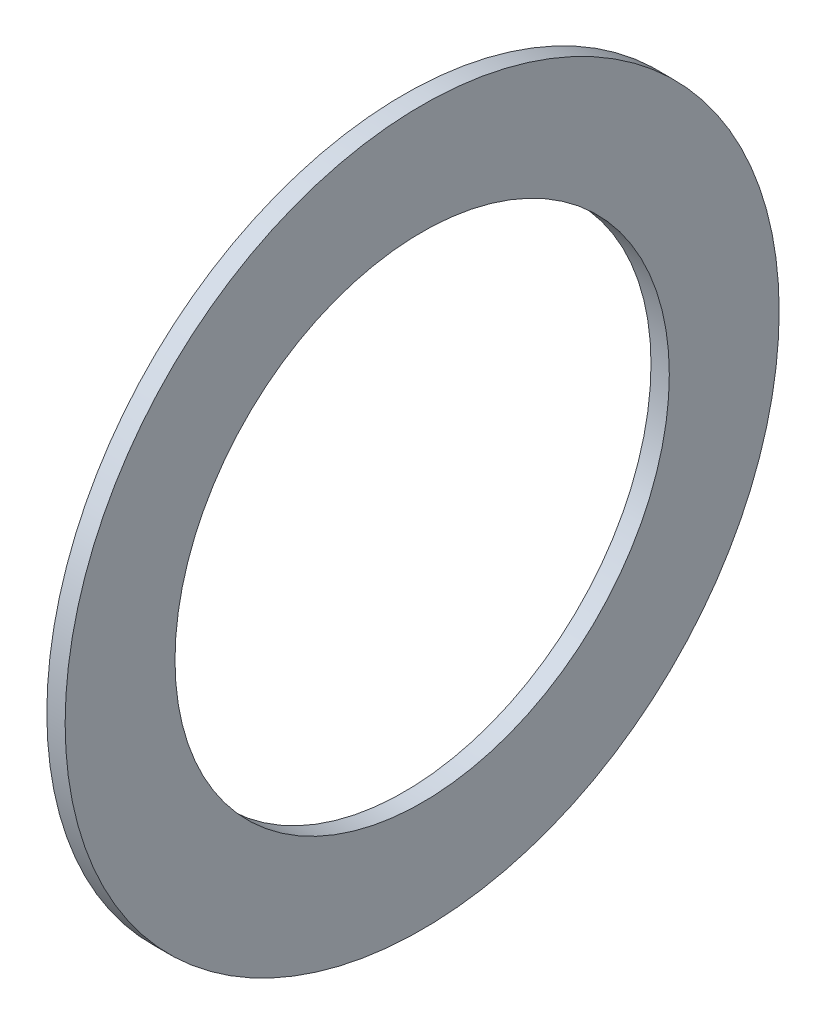
ISO-10303-21;
HEADER;
FILE_DESCRIPTION(('STEP AP214'),'2;1');
FILE_NAME('part.step','',(''),(''),'','','');
FILE_SCHEMA(('AUTOMOTIVE_DESIGN { 1 0 10303 214 1 1 1 1 }'));
ENDSEC;
DATA;
#1=APPLICATION_CONTEXT('core data for automotive mechanical design processes');
#2=APPLICATION_PROTOCOL_DEFINITION('international standard','automotive_design',2000,#1);
#3=PRODUCT_CONTEXT('',#1,'mechanical');
#4=PRODUCT('Part','Part','',(#3));
#5=PRODUCT_RELATED_PRODUCT_CATEGORY('part','',(#4));
#6=PRODUCT_DEFINITION_FORMATION('','',#4);
#7=PRODUCT_DEFINITION_CONTEXT('part definition',#1,'design');
#8=PRODUCT_DEFINITION('design','',#6,#7);
#9=PRODUCT_DEFINITION_SHAPE('','',#8);
#10=(LENGTH_UNIT() NAMED_UNIT(*) SI_UNIT(.MILLI.,.METRE.));
#11=(NAMED_UNIT(*) PLANE_ANGLE_UNIT() SI_UNIT($,.RADIAN.));
#12=(NAMED_UNIT(*) SI_UNIT($,.STERADIAN.) SOLID_ANGLE_UNIT());
#13=UNCERTAINTY_MEASURE_WITH_UNIT(LENGTH_MEASURE(1.E-05),#10,'distance_accuracy_value','');
#14=(GEOMETRIC_REPRESENTATION_CONTEXT(3) GLOBAL_UNCERTAINTY_ASSIGNED_CONTEXT((#13)) GLOBAL_UNIT_ASSIGNED_CONTEXT((#10,
#11,#12)) REPRESENTATION_CONTEXT('',''));
#15=CARTESIAN_POINT('',(0.,0.,0.));
#16=DIRECTION('',(0.,0.,1.));
#17=DIRECTION('',(1.,0.,0.));
#18=AXIS2_PLACEMENT_3D('',#15,#16,#17);
#19=CARTESIAN_POINT('',(133.7,39.,0.));
#20=DIRECTION('',(1.,0.,0.));
#21=DIRECTION('',(0.,0.,-1.));
#22=AXIS2_PLACEMENT_3D('',#19,#20,#21);
#23=PLANE('',#22);
#24=CARTESIAN_POINT('',(133.7,0.,0.));
#25=DIRECTION('',(-1.,0.,0.));
#26=DIRECTION('',(0.,0.,1.));
#27=AXIS2_PLACEMENT_3D('',#24,#25,#26);
#28=CIRCLE('',#27,27.);
#29=CARTESIAN_POINT('',(133.7,0.,27.));
#30=VERTEX_POINT('',#29);
#31=EDGE_CURVE('E10',#30,#30,#28,.T.);
#32=ORIENTED_EDGE('',*,*,#31,.F.);
#33=EDGE_LOOP('',(#32));
#34=FACE_BOUND('',#33,.T.);
#35=CARTESIAN_POINT('',(133.7,0.,0.));
#36=DIRECTION('',(-1.,0.,0.));
#37=DIRECTION('',(0.,0.,1.));
#38=AXIS2_PLACEMENT_3D('',#35,#36,#37);
#39=CIRCLE('',#38,39.);
#40=CARTESIAN_POINT('',(133.7,0.,39.));
#41=VERTEX_POINT('',#40);
#42=EDGE_CURVE('E54',#41,#41,#39,.T.);
#43=ORIENTED_EDGE('',*,*,#42,.T.);
#44=EDGE_LOOP('',(#43));
#45=FACE_BOUND('',#44,.T.);
#46=ADVANCED_FACE('F37',(#34,#45),#23,.F.);
#47=CARTESIAN_POINT('',(-110.,0.,0.));
#48=DIRECTION('',(-1.,0.,0.));
#49=DIRECTION('',(0.,0.,1.));
#50=AXIS2_PLACEMENT_3D('',#47,#48,#49);
#51=CYLINDRICAL_SURFACE('',#50,27.);
#52=CARTESIAN_POINT('',(135.7,0.,0.));
#53=DIRECTION('',(-1.,0.,0.));
#54=DIRECTION('',(0.,0.,1.));
#55=AXIS2_PLACEMENT_3D('',#52,#53,#54);
#56=CIRCLE('',#55,27.);
#57=CARTESIAN_POINT('',(135.7,0.,27.));
#58=VERTEX_POINT('',#57);
#59=EDGE_CURVE('E44',#58,#58,#56,.T.);
#60=ORIENTED_EDGE('',*,*,#59,.F.);
#61=EDGE_LOOP('',(#60));
#62=FACE_BOUND('',#61,.T.);
#63=ORIENTED_EDGE('',*,*,#31,.T.);
#64=EDGE_LOOP('',(#63));
#65=FACE_BOUND('',#64,.T.);
#66=ADVANCED_FACE('F70',(#62,#65),#51,.F.);
#67=CARTESIAN_POINT('',(135.7,27.,0.));
#68=DIRECTION('',(-1.,0.,0.));
#69=DIRECTION('',(0.,0.,1.));
#70=AXIS2_PLACEMENT_3D('',#67,#68,#69);
#71=PLANE('',#70);
#72=CARTESIAN_POINT('',(135.7,0.,0.));
#73=DIRECTION('',(-1.,0.,0.));
#74=DIRECTION('',(0.,0.,1.));
#75=AXIS2_PLACEMENT_3D('',#72,#73,#74);
#76=CIRCLE('',#75,39.);
#77=CARTESIAN_POINT('',(135.7,0.,39.));
#78=VERTEX_POINT('',#77);
#79=EDGE_CURVE('E49',#78,#78,#76,.T.);
#80=ORIENTED_EDGE('',*,*,#79,.F.);
#81=EDGE_LOOP('',(#80));
#82=FACE_BOUND('',#81,.T.);
#83=ORIENTED_EDGE('',*,*,#59,.T.);
#84=EDGE_LOOP('',(#83));
#85=FACE_BOUND('',#84,.T.);
#86=ADVANCED_FACE('F65',(#82,#85),#71,.F.);
#87=CARTESIAN_POINT('',(-110.,0.,0.));
#88=DIRECTION('',(-1.,0.,0.));
#89=DIRECTION('',(0.,0.,1.));
#90=AXIS2_PLACEMENT_3D('',#87,#88,#89);
#91=CYLINDRICAL_SURFACE('',#90,39.);
#92=ORIENTED_EDGE('',*,*,#42,.F.);
#93=EDGE_LOOP('',(#92));
#94=FACE_BOUND('',#93,.T.);
#95=ORIENTED_EDGE('',*,*,#79,.T.);
#96=EDGE_LOOP('',(#95));
#97=FACE_BOUND('',#96,.T.);
#98=ADVANCED_FACE('F62',(#94,#97),#91,.T.);
#99=CLOSED_SHELL('',(#46,#66,#86,#98));
#100=MANIFOLD_SOLID_BREP('B2',#99);
#101=ADVANCED_BREP_SHAPE_REPRESENTATION('',(#18,#100),#14);
#102=SHAPE_DEFINITION_REPRESENTATION(#9,#101);
ENDSEC;
END-ISO-10303-21;
